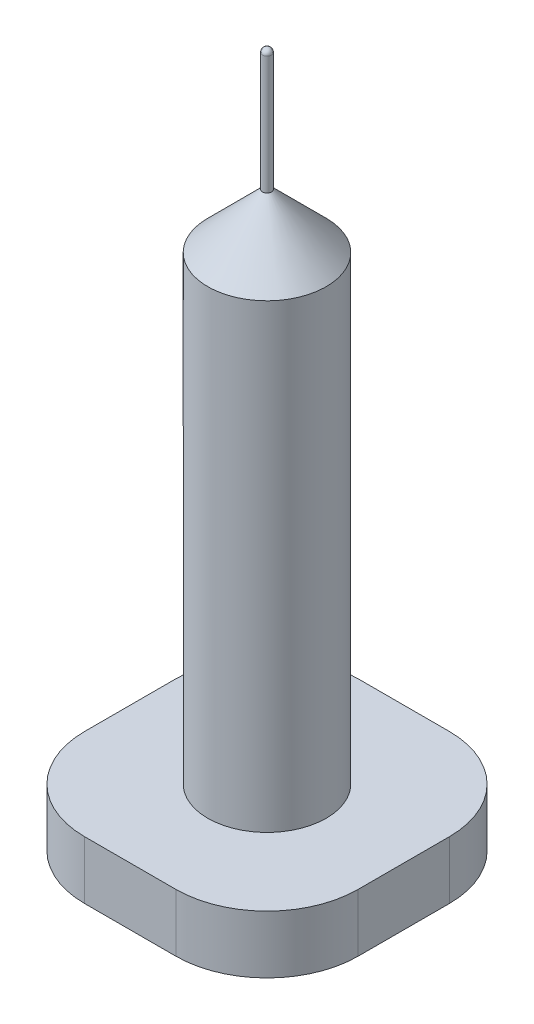
ISO-10303-21;
HEADER;
FILE_DESCRIPTION(('STEP AP214'),'2;1');
FILE_NAME('part.step','',(''),(''),'','','');
FILE_SCHEMA(('AUTOMOTIVE_DESIGN { 1 0 10303 214 1 1 1 1 }'));
ENDSEC;
DATA;
#1=APPLICATION_CONTEXT('core data for automotive mechanical design processes');
#2=APPLICATION_PROTOCOL_DEFINITION('international standard','automotive_design',2000,#1);
#3=PRODUCT_CONTEXT('',#1,'mechanical');
#4=PRODUCT('Part','Part','',(#3));
#5=PRODUCT_RELATED_PRODUCT_CATEGORY('part','',(#4));
#6=PRODUCT_DEFINITION_FORMATION('','',#4);
#7=PRODUCT_DEFINITION_CONTEXT('part definition',#1,'design');
#8=PRODUCT_DEFINITION('design','',#6,#7);
#9=PRODUCT_DEFINITION_SHAPE('','',#8);
#10=(LENGTH_UNIT() NAMED_UNIT(*) SI_UNIT(.MILLI.,.METRE.));
#11=(NAMED_UNIT(*) PLANE_ANGLE_UNIT() SI_UNIT($,.RADIAN.));
#12=(NAMED_UNIT(*) SI_UNIT($,.STERADIAN.) SOLID_ANGLE_UNIT());
#13=UNCERTAINTY_MEASURE_WITH_UNIT(LENGTH_MEASURE(1.E-05),#10,'distance_accuracy_value','');
#14=(GEOMETRIC_REPRESENTATION_CONTEXT(3) GLOBAL_UNCERTAINTY_ASSIGNED_CONTEXT((#13)) GLOBAL_UNIT_ASSIGNED_CONTEXT((#10,
#11,#12)) REPRESENTATION_CONTEXT('',''));
#15=CARTESIAN_POINT('',(0.,0.,0.));
#16=DIRECTION('',(0.,0.,1.));
#17=DIRECTION('',(1.,0.,0.));
#18=AXIS2_PLACEMENT_3D('',#15,#16,#17);
#19=CARTESIAN_POINT('',(0.,6.35,15.));
#20=DIRECTION('',(0.,0.,-1.));
#21=DIRECTION('',(-1.,0.,0.));
#22=AXIS2_PLACEMENT_3D('',#19,#20,#21);
#23=PLANE('',#22);
#24=DIRECTION('',(1.,0.,0.));
#25=VECTOR('',#24,1.);
#26=CARTESIAN_POINT('',(0.,6.35,15.));
#27=LINE('',#26,#25);
#28=CARTESIAN_POINT('',(-5.,6.35,15.));
#29=VERTEX_POINT('',#28);
#30=CARTESIAN_POINT('',(5.,6.35,15.));
#31=VERTEX_POINT('',#30);
#32=EDGE_CURVE('E134',#29,#31,#27,.T.);
#33=ORIENTED_EDGE('',*,*,#32,.F.);
#34=DIRECTION('',(0.,-1.,0.));
#35=VECTOR('',#34,1.);
#36=CARTESIAN_POINT('',(-5.,0.,15.));
#37=LINE('',#36,#35);
#38=CARTESIAN_POINT('',(-5.,0.,15.));
#39=VERTEX_POINT('',#38);
#40=EDGE_CURVE('E164',#29,#39,#37,.T.);
#41=ORIENTED_EDGE('',*,*,#40,.T.);
#42=DIRECTION('',(1.,0.,0.));
#43=VECTOR('',#42,1.);
#44=CARTESIAN_POINT('',(0.,0.,15.));
#45=LINE('',#44,#43);
#46=CARTESIAN_POINT('',(5.,0.,15.));
#47=VERTEX_POINT('',#46);
#48=EDGE_CURVE('E118',#39,#47,#45,.T.);
#49=ORIENTED_EDGE('',*,*,#48,.T.);
#50=DIRECTION('',(0.,-1.,0.));
#51=VECTOR('',#50,1.);
#52=CARTESIAN_POINT('',(5.,6.35,15.));
#53=LINE('',#52,#51);
#54=EDGE_CURVE('E162',#47,#31,#53,.F.);
#55=ORIENTED_EDGE('',*,*,#54,.T.);
#56=EDGE_LOOP('',(#33,#41,#49,#55));
#57=FACE_BOUND('',#56,.T.);
#58=ADVANCED_FACE('F45',(#57),#23,.F.);
#59=CARTESIAN_POINT('',(15.,6.35,0.));
#60=DIRECTION('',(-1.,0.,0.));
#61=DIRECTION('',(0.,0.,1.));
#62=AXIS2_PLACEMENT_3D('',#59,#60,#61);
#63=PLANE('',#62);
#64=DIRECTION('',(0.,0.,-1.));
#65=VECTOR('',#64,1.);
#66=CARTESIAN_POINT('',(15.,0.,0.));
#67=LINE('',#66,#65);
#68=CARTESIAN_POINT('',(15.,0.,5.));
#69=VERTEX_POINT('',#68);
#70=CARTESIAN_POINT('',(15.,0.,-5.));
#71=VERTEX_POINT('',#70);
#72=EDGE_CURVE('E223',#69,#71,#67,.T.);
#73=ORIENTED_EDGE('',*,*,#72,.T.);
#74=DIRECTION('',(0.,-1.,0.));
#75=VECTOR('',#74,1.);
#76=CARTESIAN_POINT('',(15.,6.35,-5.));
#77=LINE('',#76,#75);
#78=CARTESIAN_POINT('',(15.,6.35,-5.));
#79=VERTEX_POINT('',#78);
#80=EDGE_CURVE('E61',#71,#79,#77,.F.);
#81=ORIENTED_EDGE('',*,*,#80,.T.);
#82=DIRECTION('',(0.,0.,-1.));
#83=VECTOR('',#82,1.);
#84=CARTESIAN_POINT('',(15.,6.35,0.));
#85=LINE('',#84,#83);
#86=CARTESIAN_POINT('',(15.,6.35,5.));
#87=VERTEX_POINT('',#86);
#88=EDGE_CURVE('E224',#87,#79,#85,.T.);
#89=ORIENTED_EDGE('',*,*,#88,.F.);
#90=DIRECTION('',(0.,-1.,0.));
#91=VECTOR('',#90,1.);
#92=CARTESIAN_POINT('',(15.,6.35,5.));
#93=LINE('',#92,#91);
#94=EDGE_CURVE('E166',#87,#69,#93,.T.);
#95=ORIENTED_EDGE('',*,*,#94,.T.);
#96=EDGE_LOOP('',(#73,#81,#89,#95));
#97=FACE_BOUND('',#96,.T.);
#98=ADVANCED_FACE('F189',(#97),#63,.F.);
#99=CARTESIAN_POINT('',(0.,6.35,-15.));
#100=DIRECTION('',(0.,0.,-1.));
#101=DIRECTION('',(-1.,0.,0.));
#102=AXIS2_PLACEMENT_3D('',#99,#100,#101);
#103=PLANE('',#102);
#104=DIRECTION('',(1.,0.,0.));
#105=VECTOR('',#104,1.);
#106=CARTESIAN_POINT('',(0.,0.,-15.));
#107=LINE('',#106,#105);
#108=CARTESIAN_POINT('',(-5.,0.,-15.));
#109=VERTEX_POINT('',#108);
#110=CARTESIAN_POINT('',(5.,0.,-15.));
#111=VERTEX_POINT('',#110);
#112=EDGE_CURVE('E135',#109,#111,#107,.T.);
#113=ORIENTED_EDGE('',*,*,#112,.F.);
#114=DIRECTION('',(0.,-1.,0.));
#115=VECTOR('',#114,1.);
#116=CARTESIAN_POINT('',(-5.,6.35,-15.));
#117=LINE('',#116,#115);
#118=CARTESIAN_POINT('',(-5.,6.35,-15.));
#119=VERTEX_POINT('',#118);
#120=EDGE_CURVE('E154',#109,#119,#117,.F.);
#121=ORIENTED_EDGE('',*,*,#120,.T.);
#122=DIRECTION('',(1.,0.,0.));
#123=VECTOR('',#122,1.);
#124=CARTESIAN_POINT('',(0.,6.35,-15.));
#125=LINE('',#124,#123);
#126=CARTESIAN_POINT('',(5.,6.35,-15.));
#127=VERTEX_POINT('',#126);
#128=EDGE_CURVE('E144',#119,#127,#125,.T.);
#129=ORIENTED_EDGE('',*,*,#128,.T.);
#130=DIRECTION('',(0.,-1.,0.));
#131=VECTOR('',#130,1.);
#132=CARTESIAN_POINT('',(5.,0.,-15.));
#133=LINE('',#132,#131);
#134=EDGE_CURVE('E151',#127,#111,#133,.T.);
#135=ORIENTED_EDGE('',*,*,#134,.T.);
#136=EDGE_LOOP('',(#113,#121,#129,#135));
#137=FACE_BOUND('',#136,.T.);
#138=ADVANCED_FACE('F195',(#137),#103,.T.);
#139=CARTESIAN_POINT('',(-15.,6.35,0.));
#140=DIRECTION('',(-1.,0.,0.));
#141=DIRECTION('',(0.,0.,1.));
#142=AXIS2_PLACEMENT_3D('',#139,#140,#141);
#143=PLANE('',#142);
#144=DIRECTION('',(0.,0.,-1.));
#145=VECTOR('',#144,1.);
#146=CARTESIAN_POINT('',(-15.,6.35,0.));
#147=LINE('',#146,#145);
#148=CARTESIAN_POINT('',(-15.,6.35,5.));
#149=VERTEX_POINT('',#148);
#150=CARTESIAN_POINT('',(-15.,6.35,-5.));
#151=VERTEX_POINT('',#150);
#152=EDGE_CURVE('E140',#149,#151,#147,.T.);
#153=ORIENTED_EDGE('',*,*,#152,.T.);
#154=DIRECTION('',(0.,-1.,0.));
#155=VECTOR('',#154,1.);
#156=CARTESIAN_POINT('',(-15.,6.35,-5.));
#157=LINE('',#156,#155);
#158=CARTESIAN_POINT('',(-15.,0.,-5.));
#159=VERTEX_POINT('',#158);
#160=EDGE_CURVE('E133',#151,#159,#157,.T.);
#161=ORIENTED_EDGE('',*,*,#160,.T.);
#162=DIRECTION('',(0.,0.,-1.));
#163=VECTOR('',#162,1.);
#164=CARTESIAN_POINT('',(-15.,0.,0.));
#165=LINE('',#164,#163);
#166=CARTESIAN_POINT('',(-15.,0.,5.));
#167=VERTEX_POINT('',#166);
#168=EDGE_CURVE('E116',#167,#159,#165,.T.);
#169=ORIENTED_EDGE('',*,*,#168,.F.);
#170=DIRECTION('',(0.,-1.,0.));
#171=VECTOR('',#170,1.);
#172=CARTESIAN_POINT('',(-15.,6.35,5.));
#173=LINE('',#172,#171);
#174=EDGE_CURVE('E130',#167,#149,#173,.F.);
#175=ORIENTED_EDGE('',*,*,#174,.T.);
#176=EDGE_LOOP('',(#153,#161,#169,#175));
#177=FACE_BOUND('',#176,.T.);
#178=ADVANCED_FACE('F129',(#177),#143,.T.);
#179=CARTESIAN_POINT('',(0.,6.35,0.));
#180=DIRECTION('',(0.,1.,0.));
#181=DIRECTION('',(0.,0.,1.));
#182=AXIS2_PLACEMENT_3D('',#179,#180,#181);
#183=PLANE('',#182);
#184=CARTESIAN_POINT('',(0.,6.35,0.));
#185=DIRECTION('',(0.,1.,0.));
#186=DIRECTION('',(0.,0.,1.));
#187=AXIS2_PLACEMENT_3D('',#184,#185,#186);
#188=CIRCLE('',#187,6.5);
#189=CARTESIAN_POINT('',(0.,6.35,6.5));
#190=VERTEX_POINT('',#189);
#191=EDGE_CURVE('E170',#190,#190,#188,.T.);
#192=ORIENTED_EDGE('',*,*,#191,.F.);
#193=EDGE_LOOP('',(#192));
#194=FACE_BOUND('',#193,.T.);
#195=ORIENTED_EDGE('',*,*,#128,.F.);
#196=CARTESIAN_POINT('',(-5.,6.35,-5.));
#197=DIRECTION('',(0.,1.,0.));
#198=DIRECTION('',(0.,0.,1.));
#199=AXIS2_PLACEMENT_3D('',#196,#197,#198);
#200=CIRCLE('',#199,10.);
#201=EDGE_CURVE('E160',#119,#151,#200,.T.);
#202=ORIENTED_EDGE('',*,*,#201,.T.);
#203=ORIENTED_EDGE('',*,*,#152,.F.);
#204=CARTESIAN_POINT('',(-5.,6.35,5.));
#205=DIRECTION('',(0.,1.,0.));
#206=DIRECTION('',(0.,0.,1.));
#207=AXIS2_PLACEMENT_3D('',#204,#205,#206);
#208=CIRCLE('',#207,10.);
#209=EDGE_CURVE('E139',#149,#29,#208,.T.);
#210=ORIENTED_EDGE('',*,*,#209,.T.);
#211=ORIENTED_EDGE('',*,*,#32,.T.);
#212=CARTESIAN_POINT('',(5.,6.35,5.));
#213=DIRECTION('',(0.,1.,0.));
#214=DIRECTION('',(0.,0.,1.));
#215=AXIS2_PLACEMENT_3D('',#212,#213,#214);
#216=CIRCLE('',#215,10.);
#217=EDGE_CURVE('E68',#31,#87,#216,.T.);
#218=ORIENTED_EDGE('',*,*,#217,.T.);
#219=ORIENTED_EDGE('',*,*,#88,.T.);
#220=CARTESIAN_POINT('',(5.,6.35,-5.));
#221=DIRECTION('',(0.,1.,0.));
#222=DIRECTION('',(0.,0.,1.));
#223=AXIS2_PLACEMENT_3D('',#220,#221,#222);
#224=CIRCLE('',#223,10.);
#225=EDGE_CURVE('E157',#79,#127,#224,.T.);
#226=ORIENTED_EDGE('',*,*,#225,.T.);
#227=EDGE_LOOP('',(#195,#202,#203,#210,#211,#218,#219,#226));
#228=FACE_BOUND('',#227,.T.);
#229=ADVANCED_FACE('F237',(#194,#228),#183,.T.);
#230=CARTESIAN_POINT('',(0.,0.,0.));
#231=DIRECTION('',(0.,1.,0.));
#232=DIRECTION('',(0.,0.,1.));
#233=AXIS2_PLACEMENT_3D('',#230,#231,#232);
#234=PLANE('',#233);
#235=ORIENTED_EDGE('',*,*,#168,.T.);
#236=CARTESIAN_POINT('',(-5.,0.,-5.));
#237=DIRECTION('',(0.,1.,0.));
#238=DIRECTION('',(0.,0.,1.));
#239=AXIS2_PLACEMENT_3D('',#236,#237,#238);
#240=CIRCLE('',#239,10.);
#241=EDGE_CURVE('E123',#159,#109,#240,.F.);
#242=ORIENTED_EDGE('',*,*,#241,.T.);
#243=ORIENTED_EDGE('',*,*,#112,.T.);
#244=CARTESIAN_POINT('',(5.,0.,-5.));
#245=DIRECTION('',(0.,1.,0.));
#246=DIRECTION('',(0.,0.,1.));
#247=AXIS2_PLACEMENT_3D('',#244,#245,#246);
#248=CIRCLE('',#247,10.);
#249=EDGE_CURVE('E124',#111,#71,#248,.F.);
#250=ORIENTED_EDGE('',*,*,#249,.T.);
#251=ORIENTED_EDGE('',*,*,#72,.F.);
#252=CARTESIAN_POINT('',(5.,0.,5.));
#253=DIRECTION('',(0.,1.,0.));
#254=DIRECTION('',(0.,0.,1.));
#255=AXIS2_PLACEMENT_3D('',#252,#253,#254);
#256=CIRCLE('',#255,10.);
#257=EDGE_CURVE('E142',#69,#47,#256,.F.);
#258=ORIENTED_EDGE('',*,*,#257,.T.);
#259=ORIENTED_EDGE('',*,*,#48,.F.);
#260=CARTESIAN_POINT('',(-5.,0.,5.));
#261=DIRECTION('',(0.,1.,0.));
#262=DIRECTION('',(0.,0.,1.));
#263=AXIS2_PLACEMENT_3D('',#260,#261,#262);
#264=CIRCLE('',#263,10.);
#265=EDGE_CURVE('E113',#39,#167,#264,.F.);
#266=ORIENTED_EDGE('',*,*,#265,.T.);
#267=EDGE_LOOP('',(#235,#242,#243,#250,#251,#258,#259,#266));
#268=FACE_BOUND('',#267,.T.);
#269=ADVANCED_FACE('F115',(#268),#234,.F.);
#270=CARTESIAN_POINT('',(-5.,6.35,-5.));
#271=DIRECTION('',(0.,-1.,0.));
#272=DIRECTION('',(0.,0.,-1.));
#273=AXIS2_PLACEMENT_3D('',#270,#271,#272);
#274=CYLINDRICAL_SURFACE('',#273,10.);
#275=ORIENTED_EDGE('',*,*,#201,.F.);
#276=ORIENTED_EDGE('',*,*,#120,.F.);
#277=ORIENTED_EDGE('',*,*,#241,.F.);
#278=ORIENTED_EDGE('',*,*,#160,.F.);
#279=EDGE_LOOP('',(#275,#276,#277,#278));
#280=FACE_BOUND('',#279,.T.);
#281=ADVANCED_FACE('F200',(#280),#274,.T.);
#282=CARTESIAN_POINT('',(-5.,6.35,5.));
#283=DIRECTION('',(0.,1.,0.));
#284=DIRECTION('',(0.,0.,1.));
#285=AXIS2_PLACEMENT_3D('',#282,#283,#284);
#286=CYLINDRICAL_SURFACE('',#285,10.);
#287=ORIENTED_EDGE('',*,*,#209,.F.);
#288=ORIENTED_EDGE('',*,*,#174,.F.);
#289=ORIENTED_EDGE('',*,*,#265,.F.);
#290=ORIENTED_EDGE('',*,*,#40,.F.);
#291=EDGE_LOOP('',(#287,#288,#289,#290));
#292=FACE_BOUND('',#291,.T.);
#293=ADVANCED_FACE('F138',(#292),#286,.T.);
#294=CARTESIAN_POINT('',(5.,6.35,-5.));
#295=DIRECTION('',(0.,1.,0.));
#296=DIRECTION('',(0.,0.,1.));
#297=AXIS2_PLACEMENT_3D('',#294,#295,#296);
#298=CYLINDRICAL_SURFACE('',#297,10.);
#299=ORIENTED_EDGE('',*,*,#225,.F.);
#300=ORIENTED_EDGE('',*,*,#80,.F.);
#301=ORIENTED_EDGE('',*,*,#249,.F.);
#302=ORIENTED_EDGE('',*,*,#134,.F.);
#303=EDGE_LOOP('',(#299,#300,#301,#302));
#304=FACE_BOUND('',#303,.T.);
#305=ADVANCED_FACE('F206',(#304),#298,.T.);
#306=CARTESIAN_POINT('',(5.,6.35,5.));
#307=DIRECTION('',(0.,-1.,0.));
#308=DIRECTION('',(0.,0.,-1.));
#309=AXIS2_PLACEMENT_3D('',#306,#307,#308);
#310=CYLINDRICAL_SURFACE('',#309,10.);
#311=ORIENTED_EDGE('',*,*,#217,.F.);
#312=ORIENTED_EDGE('',*,*,#54,.F.);
#313=ORIENTED_EDGE('',*,*,#257,.F.);
#314=ORIENTED_EDGE('',*,*,#94,.F.);
#315=EDGE_LOOP('',(#311,#312,#313,#314));
#316=FACE_BOUND('',#315,.T.);
#317=ADVANCED_FACE('F209',(#316),#310,.T.);
#318=CARTESIAN_POINT('',(0.,56.35,0.));
#319=DIRECTION('',(0.,-1.,0.));
#320=DIRECTION('',(0.,0.,-1.));
#321=AXIS2_PLACEMENT_3D('',#318,#319,#320);
#322=CYLINDRICAL_SURFACE('',#321,6.5);
#323=CARTESIAN_POINT('',(0.,56.8500000000001,0.));
#324=DIRECTION('',(0.,-1.,0.));
#325=DIRECTION('',(0.,0.,-1.));
#326=AXIS2_PLACEMENT_3D('',#323,#324,#325);
#327=CIRCLE('',#326,6.5);
#328=CARTESIAN_POINT('',(0.,56.8500000000001,-6.5));
#329=VERTEX_POINT('',#328);
#330=EDGE_CURVE('E11',#329,#329,#327,.T.);
#331=ORIENTED_EDGE('',*,*,#330,.T.);
#332=EDGE_LOOP('',(#331));
#333=FACE_BOUND('',#332,.T.);
#334=ORIENTED_EDGE('',*,*,#191,.T.);
#335=EDGE_LOOP('',(#334));
#336=FACE_BOUND('',#335,.T.);
#337=ADVANCED_FACE('F212',(#333,#336),#322,.T.);
#338=CARTESIAN_POINT('',(0.,76.35,0.));
#339=DIRECTION('',(0.,-1.,0.));
#340=DIRECTION('',(0.,0.,-1.));
#341=AXIS2_PLACEMENT_3D('',#338,#339,#340);
#342=CYLINDRICAL_SURFACE('',#341,0.5);
#343=CARTESIAN_POINT('',(0.,62.8500000000001,0.));
#344=DIRECTION('',(0.,1.,0.));
#345=DIRECTION('',(0.,0.,1.));
#346=AXIS2_PLACEMENT_3D('',#343,#344,#345);
#347=CIRCLE('',#346,0.5);
#348=CARTESIAN_POINT('',(0.,62.8500000000001,-0.500000000000007));
#349=VERTEX_POINT('',#348);
#350=EDGE_CURVE('E54',#349,#349,#347,.T.);
#351=ORIENTED_EDGE('',*,*,#350,.T.);
#352=EDGE_LOOP('',(#351));
#353=FACE_BOUND('',#352,.T.);
#354=CARTESIAN_POINT('',(0.,75.85,0.));
#355=DIRECTION('',(0.,-1.,0.));
#356=DIRECTION('',(0.,0.,-1.));
#357=AXIS2_PLACEMENT_3D('',#354,#355,#356);
#358=CIRCLE('',#357,0.5);
#359=CARTESIAN_POINT('',(0.,75.85,-0.5));
#360=VERTEX_POINT('',#359);
#361=EDGE_CURVE('E171',#360,#360,#358,.T.);
#362=ORIENTED_EDGE('',*,*,#361,.T.);
#363=EDGE_LOOP('',(#362));
#364=FACE_BOUND('',#363,.T.);
#365=ADVANCED_FACE('F176',(#353,#364),#342,.T.);
#366=CARTESIAN_POINT('',(0.,75.85,0.));
#367=DIRECTION('',(0.,1.,0.));
#368=DIRECTION('',(0.,0.,1.));
#369=AXIS2_PLACEMENT_3D('',#366,#367,#368);
#370=SPHERICAL_SURFACE('',#369,0.5);
#371=ORIENTED_EDGE('',*,*,#361,.F.);
#372=EDGE_LOOP('',(#371));
#373=FACE_BOUND('',#372,.T.);
#374=ADVANCED_FACE('F180',(#373),#370,.T.);
#375=CARTESIAN_POINT('',(0.,62.8500000000001,0.));
#376=DIRECTION('',(0.,-1.,0.));
#377=DIRECTION('',(0.,0.,-1.));
#378=AXIS2_PLACEMENT_3D('',#375,#376,#377);
#379=CONICAL_SURFACE('',#378,0.5,0.785398163397443);
#380=CARTESIAN_POINT('',(0.,56.8500000000001,-6.5));
#381=CARTESIAN_POINT('',(0.,56.9125000000001,-6.4375));
#382=CARTESIAN_POINT('',(0.,56.9750000000001,-6.375));
#383=CARTESIAN_POINT('',(0.,57.1000000000001,-6.25));
#384=CARTESIAN_POINT('',(0.,57.1625000000001,-6.1875));
#385=CARTESIAN_POINT('',(0.,57.2875000000001,-6.0625));
#386=CARTESIAN_POINT('',(0.,57.3500000000001,-6.));
#387=CARTESIAN_POINT('',(0.,57.4750000000001,-5.875));
#388=CARTESIAN_POINT('',(0.,57.5375000000001,-5.8125));
#389=CARTESIAN_POINT('',(0.,57.6625000000001,-5.6875));
#390=CARTESIAN_POINT('',(0.,57.7250000000001,-5.625));
#391=CARTESIAN_POINT('',(0.,57.8500000000001,-5.5));
#392=CARTESIAN_POINT('',(0.,57.9125000000001,-5.4375));
#393=CARTESIAN_POINT('',(0.,58.0375000000001,-5.3125));
#394=CARTESIAN_POINT('',(0.,58.1000000000001,-5.25));
#395=CARTESIAN_POINT('',(0.,58.2250000000001,-5.125));
#396=CARTESIAN_POINT('',(0.,58.2875000000001,-5.0625));
#397=CARTESIAN_POINT('',(0.,58.4125000000001,-4.9375));
#398=CARTESIAN_POINT('',(0.,58.4750000000001,-4.875));
#399=CARTESIAN_POINT('',(0.,58.6000000000001,-4.75));
#400=CARTESIAN_POINT('',(0.,58.6625000000001,-4.6875));
#401=CARTESIAN_POINT('',(0.,58.7875000000001,-4.5625));
#402=CARTESIAN_POINT('',(0.,58.8500000000001,-4.5));
#403=CARTESIAN_POINT('',(0.,58.9750000000001,-4.375));
#404=CARTESIAN_POINT('',(0.,59.0375000000001,-4.3125));
#405=CARTESIAN_POINT('',(0.,59.1625000000001,-4.1875));
#406=CARTESIAN_POINT('',(0.,59.2250000000001,-4.125));
#407=CARTESIAN_POINT('',(0.,59.3500000000001,-4.));
#408=CARTESIAN_POINT('',(0.,59.4125000000001,-3.9375));
#409=CARTESIAN_POINT('',(0.,59.5375000000001,-3.8125));
#410=CARTESIAN_POINT('',(0.,59.6000000000001,-3.75));
#411=CARTESIAN_POINT('',(0.,59.7250000000001,-3.625));
#412=CARTESIAN_POINT('',(0.,59.7875000000001,-3.5625));
#413=CARTESIAN_POINT('',(0.,59.9125000000001,-3.4375));
#414=CARTESIAN_POINT('',(0.,59.9750000000001,-3.375));
#415=CARTESIAN_POINT('',(0.,60.1000000000001,-3.25));
#416=CARTESIAN_POINT('',(0.,60.1625000000001,-3.1875));
#417=CARTESIAN_POINT('',(0.,60.2875000000001,-3.0625));
#418=CARTESIAN_POINT('',(0.,60.3500000000001,-3.));
#419=CARTESIAN_POINT('',(0.,60.4750000000001,-2.875));
#420=CARTESIAN_POINT('',(0.,60.5375000000001,-2.8125));
#421=CARTESIAN_POINT('',(0.,60.6625000000001,-2.6875));
#422=CARTESIAN_POINT('',(0.,60.7250000000001,-2.625));
#423=CARTESIAN_POINT('',(0.,60.8500000000001,-2.5));
#424=CARTESIAN_POINT('',(0.,60.9125000000001,-2.4375));
#425=CARTESIAN_POINT('',(0.,61.0375000000001,-2.3125));
#426=CARTESIAN_POINT('',(0.,61.1000000000001,-2.25));
#427=CARTESIAN_POINT('',(0.,61.2250000000001,-2.125));
#428=CARTESIAN_POINT('',(0.,61.2875000000001,-2.0625));
#429=CARTESIAN_POINT('',(0.,61.4125000000001,-1.9375));
#430=CARTESIAN_POINT('',(0.,61.4750000000001,-1.87500000000001));
#431=CARTESIAN_POINT('',(0.,61.6000000000001,-1.75000000000001));
#432=CARTESIAN_POINT('',(0.,61.6625000000001,-1.68750000000001));
#433=CARTESIAN_POINT('',(0.,61.7875000000001,-1.56250000000001));
#434=CARTESIAN_POINT('',(0.,61.8500000000001,-1.50000000000001));
#435=CARTESIAN_POINT('',(0.,61.9750000000001,-1.37500000000001));
#436=CARTESIAN_POINT('',(0.,62.0375000000001,-1.31250000000001));
#437=CARTESIAN_POINT('',(0.,62.1625000000001,-1.18750000000001));
#438=CARTESIAN_POINT('',(0.,62.2250000000001,-1.12500000000001));
#439=CARTESIAN_POINT('',(0.,62.3500000000001,-1.00000000000001));
#440=CARTESIAN_POINT('',(0.,62.4125000000001,-0.937500000000006));
#441=CARTESIAN_POINT('',(0.,62.5375000000001,-0.812500000000007));
#442=CARTESIAN_POINT('',(0.,62.6000000000001,-0.750000000000007));
#443=CARTESIAN_POINT('',(0.,62.7250000000001,-0.625000000000008));
#444=CARTESIAN_POINT('',(0.,62.7875000000001,-0.562500000000008));
#445=CARTESIAN_POINT('',(0.,62.8500000000001,-0.500000000000007));
#446=B_SPLINE_CURVE_WITH_KNOTS('',3,(#380,#381,#382,#383,#384,#385,#386,#387,#388,#389,#390,
#391,#392,#393,#394,#395,#396,#397,#398,#399,#400,#401,#402,#403,#404,#405,#406,#407,#408,#409,
#410,#411,#412,#413,#414,#415,#416,#417,#418,#419,#420,#421,#422,#423,#424,#425,#426,#427,#428,
#429,#430,#431,#432,#433,#434,#435,#436,#437,#438,#439,#440,#441,#442,#443,#444,#445),
.UNSPECIFIED.,.F.,.F.,(4,2,2,2,2,2,2,2,2,2,2,2,2,2,2,2,2,2,2,2,2,2,2,2,2,2,2,2,2,2,2,2,4),(0.,
0.26516504294496,0.530330085889916,0.795495128834872,1.06066017177983,1.32582521472478,
1.59099025766974,1.8561553006147,2.12132034355965,2.38648538650461,2.65165042944956,
2.91681547239452,3.18198051533948,3.44714555828443,3.71231060122939,3.97747564417435,
4.24264068711931,4.50780573006426,4.77297077300922,5.03813581595417,5.30330085889913,
5.56846590184409,5.83363094478904,6.098795987734,6.36396103067895,6.62912607362391,
6.89429111656887,7.15945615951382,7.42462120245878,7.68978624540373,7.95495128834869,
8.22011633129365,8.4852813742386),.UNSPECIFIED.);
#447=EDGE_CURVE('BSEAM48',#329,#349,#446,.T.);
#448=ORIENTED_EDGE('',*,*,#330,.F.);
#449=ORIENTED_EDGE('',*,*,#350,.F.);
#450=ORIENTED_EDGE('',*,*,#447,.T.);
#451=ORIENTED_EDGE('',*,*,#447,.F.);
#452=EDGE_LOOP('',(#448,#450,#449,#451));
#453=FACE_BOUND('',#452,.T.);
#454=ADVANCED_FACE('F48',(#453),#379,.T.);
#455=CLOSED_SHELL('',(#58,#98,#138,#178,#229,#269,#281,#293,#305,#317,#337,#365,#374,#454));
#456=MANIFOLD_SOLID_BREP('B2',#455);
#457=ADVANCED_BREP_SHAPE_REPRESENTATION('',(#18,#456),#14);
#458=SHAPE_DEFINITION_REPRESENTATION(#9,#457);
ENDSEC;
END-ISO-10303-21;
